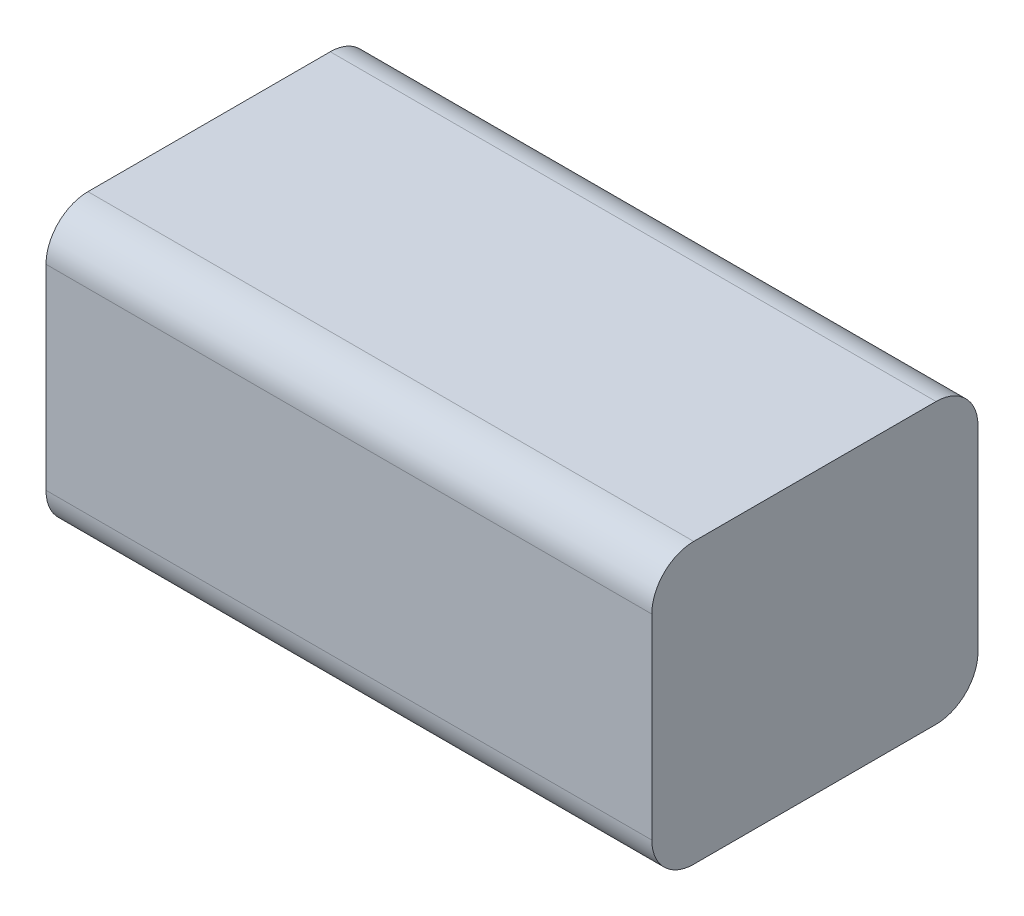
ISO-10303-21;
HEADER;
FILE_DESCRIPTION(('STEP AP214'),'2;1');
FILE_NAME('part.step','',(''),(''),'','','');
FILE_SCHEMA(('AUTOMOTIVE_DESIGN { 1 0 10303 214 1 1 1 1 }'));
ENDSEC;
DATA;
#1=APPLICATION_CONTEXT('core data for automotive mechanical design processes');
#2=APPLICATION_PROTOCOL_DEFINITION('international standard','automotive_design',2000,#1);
#3=PRODUCT_CONTEXT('',#1,'mechanical');
#4=PRODUCT('Part','Part','',(#3));
#5=PRODUCT_RELATED_PRODUCT_CATEGORY('part','',(#4));
#6=PRODUCT_DEFINITION_FORMATION('','',#4);
#7=PRODUCT_DEFINITION_CONTEXT('part definition',#1,'design');
#8=PRODUCT_DEFINITION('design','',#6,#7);
#9=PRODUCT_DEFINITION_SHAPE('','',#8);
#10=(LENGTH_UNIT() NAMED_UNIT(*) SI_UNIT(.MILLI.,.METRE.));
#11=(NAMED_UNIT(*) PLANE_ANGLE_UNIT() SI_UNIT($,.RADIAN.));
#12=(NAMED_UNIT(*) SI_UNIT($,.STERADIAN.) SOLID_ANGLE_UNIT());
#13=UNCERTAINTY_MEASURE_WITH_UNIT(LENGTH_MEASURE(1.E-05),#10,'distance_accuracy_value','');
#14=(GEOMETRIC_REPRESENTATION_CONTEXT(3) GLOBAL_UNCERTAINTY_ASSIGNED_CONTEXT((#13)) GLOBAL_UNIT_ASSIGNED_CONTEXT((#10,
#11,#12)) REPRESENTATION_CONTEXT('',''));
#15=CARTESIAN_POINT('',(0.,0.,0.));
#16=DIRECTION('',(0.,0.,1.));
#17=DIRECTION('',(1.,0.,0.));
#18=AXIS2_PLACEMENT_3D('',#15,#16,#17);
#19=CARTESIAN_POINT('',(65.,0.,35.));
#20=DIRECTION('',(0.,1.,0.));
#21=DIRECTION('',(-1.,0.,0.));
#22=AXIS2_PLACEMENT_3D('',#19,#20,#21);
#23=PLANE('',#22);
#24=DIRECTION('',(0.,0.,-1.));
#25=VECTOR('',#24,1.);
#26=CARTESIAN_POINT('',(65.,0.,35.));
#27=LINE('',#26,#25);
#28=CARTESIAN_POINT('',(65.,0.,30.5));
#29=VERTEX_POINT('',#28);
#30=CARTESIAN_POINT('',(65.,0.,4.5));
#31=VERTEX_POINT('',#30);
#32=EDGE_CURVE('E145',#29,#31,#27,.T.);
#33=ORIENTED_EDGE('',*,*,#32,.F.);
#34=DIRECTION('',(1.,0.,0.));
#35=VECTOR('',#34,1.);
#36=CARTESIAN_POINT('',(65.,0.,30.5));
#37=LINE('',#36,#35);
#38=CARTESIAN_POINT('',(0.,0.,30.5));
#39=VERTEX_POINT('',#38);
#40=EDGE_CURVE('E106',#29,#39,#37,.F.);
#41=ORIENTED_EDGE('',*,*,#40,.T.);
#42=DIRECTION('',(0.,0.,-1.));
#43=VECTOR('',#42,1.);
#44=CARTESIAN_POINT('',(0.,0.,35.));
#45=LINE('',#44,#43);
#46=CARTESIAN_POINT('',(0.,0.,4.5));
#47=VERTEX_POINT('',#46);
#48=EDGE_CURVE('E130',#39,#47,#45,.T.);
#49=ORIENTED_EDGE('',*,*,#48,.T.);
#50=DIRECTION('',(1.,0.,0.));
#51=VECTOR('',#50,1.);
#52=CARTESIAN_POINT('',(65.,0.,4.5));
#53=LINE('',#52,#51);
#54=EDGE_CURVE('E111',#47,#31,#53,.T.);
#55=ORIENTED_EDGE('',*,*,#54,.T.);
#56=EDGE_LOOP('',(#33,#41,#49,#55));
#57=FACE_BOUND('',#56,.T.);
#58=ADVANCED_FACE('F35',(#57),#23,.F.);
#59=CARTESIAN_POINT('',(65.,30.,35.));
#60=DIRECTION('',(-1.,0.,0.));
#61=DIRECTION('',(0.,0.,1.));
#62=AXIS2_PLACEMENT_3D('',#59,#60,#61);
#63=PLANE('',#62);
#64=DIRECTION('',(0.,1.,0.));
#65=VECTOR('',#64,1.);
#66=CARTESIAN_POINT('',(65.,30.,35.));
#67=LINE('',#66,#65);
#68=CARTESIAN_POINT('',(65.,4.50000000000001,35.));
#69=VERTEX_POINT('',#68);
#70=CARTESIAN_POINT('',(65.,25.5,35.));
#71=VERTEX_POINT('',#70);
#72=EDGE_CURVE('E119',#69,#71,#67,.T.);
#73=ORIENTED_EDGE('',*,*,#72,.F.);
#74=CARTESIAN_POINT('',(65.,4.50000000000002,30.5));
#75=DIRECTION('',(-1.,0.,0.));
#76=DIRECTION('',(0.,0.,1.));
#77=AXIS2_PLACEMENT_3D('',#74,#75,#76);
#78=CIRCLE('',#77,4.5);
#79=EDGE_CURVE('E101',#69,#29,#78,.F.);
#80=ORIENTED_EDGE('',*,*,#79,.T.);
#81=ORIENTED_EDGE('',*,*,#32,.T.);
#82=CARTESIAN_POINT('',(65.,4.50000000000002,4.5));
#83=DIRECTION('',(-1.,0.,0.));
#84=DIRECTION('',(0.,0.,1.));
#85=AXIS2_PLACEMENT_3D('',#82,#83,#84);
#86=CIRCLE('',#85,4.5);
#87=CARTESIAN_POINT('',(65.,4.50000000000001,0.));
#88=VERTEX_POINT('',#87);
#89=EDGE_CURVE('E112',#31,#88,#86,.F.);
#90=ORIENTED_EDGE('',*,*,#89,.T.);
#91=DIRECTION('',(0.,1.,0.));
#92=VECTOR('',#91,1.);
#93=CARTESIAN_POINT('',(65.,30.,0.));
#94=LINE('',#93,#92);
#95=CARTESIAN_POINT('',(65.,25.5,0.));
#96=VERTEX_POINT('',#95);
#97=EDGE_CURVE('E133',#88,#96,#94,.T.);
#98=ORIENTED_EDGE('',*,*,#97,.T.);
#99=CARTESIAN_POINT('',(65.,25.5,4.5));
#100=DIRECTION('',(-1.,0.,0.));
#101=DIRECTION('',(0.,0.,1.));
#102=AXIS2_PLACEMENT_3D('',#99,#100,#101);
#103=CIRCLE('',#102,4.5);
#104=CARTESIAN_POINT('',(65.,30.,4.5));
#105=VERTEX_POINT('',#104);
#106=EDGE_CURVE('E149',#96,#105,#103,.F.);
#107=ORIENTED_EDGE('',*,*,#106,.T.);
#108=DIRECTION('',(0.,0.,-1.));
#109=VECTOR('',#108,1.);
#110=CARTESIAN_POINT('',(65.,30.,35.));
#111=LINE('',#110,#109);
#112=CARTESIAN_POINT('',(65.,30.,30.5));
#113=VERTEX_POINT('',#112);
#114=EDGE_CURVE('E142',#113,#105,#111,.T.);
#115=ORIENTED_EDGE('',*,*,#114,.F.);
#116=CARTESIAN_POINT('',(65.,25.5,30.5));
#117=DIRECTION('',(-1.,0.,0.));
#118=DIRECTION('',(0.,0.,1.));
#119=AXIS2_PLACEMENT_3D('',#116,#117,#118);
#120=CIRCLE('',#119,4.5);
#121=EDGE_CURVE('E122',#113,#71,#120,.F.);
#122=ORIENTED_EDGE('',*,*,#121,.T.);
#123=EDGE_LOOP('',(#73,#80,#81,#90,#98,#107,#115,#122));
#124=FACE_BOUND('',#123,.T.);
#125=ADVANCED_FACE('F125',(#124),#63,.F.);
#126=CARTESIAN_POINT('',(0.,30.,35.));
#127=DIRECTION('',(0.,-1.,0.));
#128=DIRECTION('',(1.,0.,0.));
#129=AXIS2_PLACEMENT_3D('',#126,#127,#128);
#130=PLANE('',#129);
#131=ORIENTED_EDGE('',*,*,#114,.T.);
#132=DIRECTION('',(-1.,0.,0.));
#133=VECTOR('',#132,1.);
#134=CARTESIAN_POINT('',(0.,30.,4.5));
#135=LINE('',#134,#133);
#136=CARTESIAN_POINT('',(0.,30.,4.5));
#137=VERTEX_POINT('',#136);
#138=EDGE_CURVE('E11',#105,#137,#135,.T.);
#139=ORIENTED_EDGE('',*,*,#138,.T.);
#140=DIRECTION('',(0.,0.,-1.));
#141=VECTOR('',#140,1.);
#142=CARTESIAN_POINT('',(0.,30.,35.));
#143=LINE('',#142,#141);
#144=CARTESIAN_POINT('',(0.,30.,30.5));
#145=VERTEX_POINT('',#144);
#146=EDGE_CURVE('E140',#145,#137,#143,.T.);
#147=ORIENTED_EDGE('',*,*,#146,.F.);
#148=DIRECTION('',(-1.,0.,0.));
#149=VECTOR('',#148,1.);
#150=CARTESIAN_POINT('',(0.,30.,30.5));
#151=LINE('',#150,#149);
#152=EDGE_CURVE('E43',#145,#113,#151,.F.);
#153=ORIENTED_EDGE('',*,*,#152,.T.);
#154=EDGE_LOOP('',(#131,#139,#147,#153));
#155=FACE_BOUND('',#154,.T.);
#156=ADVANCED_FACE('F166',(#155),#130,.F.);
#157=CARTESIAN_POINT('',(0.,0.,35.));
#158=DIRECTION('',(1.,0.,0.));
#159=DIRECTION('',(0.,0.,-1.));
#160=AXIS2_PLACEMENT_3D('',#157,#158,#159);
#161=PLANE('',#160);
#162=ORIENTED_EDGE('',*,*,#48,.F.);
#163=CARTESIAN_POINT('',(0.,4.5,30.5));
#164=DIRECTION('',(1.,0.,0.));
#165=DIRECTION('',(0.,0.,-1.));
#166=AXIS2_PLACEMENT_3D('',#163,#164,#165);
#167=CIRCLE('',#166,4.5);
#168=CARTESIAN_POINT('',(0.,4.5,35.));
#169=VERTEX_POINT('',#168);
#170=EDGE_CURVE('E159',#39,#169,#167,.F.);
#171=ORIENTED_EDGE('',*,*,#170,.T.);
#172=DIRECTION('',(0.,-1.,0.));
#173=VECTOR('',#172,1.);
#174=CARTESIAN_POINT('',(0.,0.,35.));
#175=LINE('',#174,#173);
#176=CARTESIAN_POINT('',(0.,25.5,35.));
#177=VERTEX_POINT('',#176);
#178=EDGE_CURVE('E121',#177,#169,#175,.T.);
#179=ORIENTED_EDGE('',*,*,#178,.F.);
#180=CARTESIAN_POINT('',(0.,25.5,30.5));
#181=DIRECTION('',(1.,0.,0.));
#182=DIRECTION('',(0.,0.,-1.));
#183=AXIS2_PLACEMENT_3D('',#180,#181,#182);
#184=CIRCLE('',#183,4.5);
#185=EDGE_CURVE('E57',#177,#145,#184,.F.);
#186=ORIENTED_EDGE('',*,*,#185,.T.);
#187=ORIENTED_EDGE('',*,*,#146,.T.);
#188=CARTESIAN_POINT('',(0.,25.5,4.5));
#189=DIRECTION('',(1.,0.,0.));
#190=DIRECTION('',(0.,0.,-1.));
#191=AXIS2_PLACEMENT_3D('',#188,#189,#190);
#192=CIRCLE('',#191,4.5);
#193=CARTESIAN_POINT('',(0.,25.5,0.));
#194=VERTEX_POINT('',#193);
#195=EDGE_CURVE('E50',#137,#194,#192,.F.);
#196=ORIENTED_EDGE('',*,*,#195,.T.);
#197=DIRECTION('',(0.,-1.,0.));
#198=VECTOR('',#197,1.);
#199=CARTESIAN_POINT('',(0.,0.,0.));
#200=LINE('',#199,#198);
#201=CARTESIAN_POINT('',(0.,4.5,0.));
#202=VERTEX_POINT('',#201);
#203=EDGE_CURVE('E128',#194,#202,#200,.T.);
#204=ORIENTED_EDGE('',*,*,#203,.T.);
#205=CARTESIAN_POINT('',(0.,4.5,4.5));
#206=DIRECTION('',(1.,0.,0.));
#207=DIRECTION('',(0.,0.,-1.));
#208=AXIS2_PLACEMENT_3D('',#205,#206,#207);
#209=CIRCLE('',#208,4.5);
#210=EDGE_CURVE('E157',#202,#47,#209,.F.);
#211=ORIENTED_EDGE('',*,*,#210,.T.);
#212=EDGE_LOOP('',(#162,#171,#179,#186,#187,#196,#204,#211));
#213=FACE_BOUND('',#212,.T.);
#214=ADVANCED_FACE('F170',(#213),#161,.F.);
#215=CARTESIAN_POINT('',(0.,0.,35.));
#216=DIRECTION('',(0.,0.,-1.));
#217=DIRECTION('',(-1.,0.,0.));
#218=AXIS2_PLACEMENT_3D('',#215,#216,#217);
#219=PLANE('',#218);
#220=ORIENTED_EDGE('',*,*,#178,.T.);
#221=DIRECTION('',(1.,0.,0.));
#222=VECTOR('',#221,1.);
#223=CARTESIAN_POINT('',(0.,4.5,35.));
#224=LINE('',#223,#222);
#225=EDGE_CURVE('E105',#169,#69,#224,.T.);
#226=ORIENTED_EDGE('',*,*,#225,.T.);
#227=ORIENTED_EDGE('',*,*,#72,.T.);
#228=DIRECTION('',(-1.,0.,0.));
#229=VECTOR('',#228,1.);
#230=CARTESIAN_POINT('',(0.,25.5,35.));
#231=LINE('',#230,#229);
#232=EDGE_CURVE('E123',#71,#177,#231,.T.);
#233=ORIENTED_EDGE('',*,*,#232,.T.);
#234=EDGE_LOOP('',(#220,#226,#227,#233));
#235=FACE_BOUND('',#234,.T.);
#236=ADVANCED_FACE('F117',(#235),#219,.F.);
#237=CARTESIAN_POINT('',(0.,0.,0.));
#238=DIRECTION('',(0.,0.,-1.));
#239=DIRECTION('',(-1.,0.,0.));
#240=AXIS2_PLACEMENT_3D('',#237,#238,#239);
#241=PLANE('',#240);
#242=ORIENTED_EDGE('',*,*,#97,.F.);
#243=DIRECTION('',(1.,0.,0.));
#244=VECTOR('',#243,1.);
#245=CARTESIAN_POINT('',(0.,4.5,0.));
#246=LINE('',#245,#244);
#247=EDGE_CURVE('E163',#88,#202,#246,.F.);
#248=ORIENTED_EDGE('',*,*,#247,.T.);
#249=ORIENTED_EDGE('',*,*,#203,.F.);
#250=DIRECTION('',(-1.,0.,0.));
#251=VECTOR('',#250,1.);
#252=CARTESIAN_POINT('',(65.,25.5,0.));
#253=LINE('',#252,#251);
#254=EDGE_CURVE('E161',#194,#96,#253,.F.);
#255=ORIENTED_EDGE('',*,*,#254,.T.);
#256=EDGE_LOOP('',(#242,#248,#249,#255));
#257=FACE_BOUND('',#256,.T.);
#258=ADVANCED_FACE('F179',(#257),#241,.T.);
#259=CARTESIAN_POINT('',(0.,4.5,30.5));
#260=DIRECTION('',(1.,0.,0.));
#261=DIRECTION('',(0.,1.,0.));
#262=AXIS2_PLACEMENT_3D('',#259,#260,#261);
#263=CYLINDRICAL_SURFACE('',#262,4.5);
#264=ORIENTED_EDGE('',*,*,#170,.F.);
#265=ORIENTED_EDGE('',*,*,#40,.F.);
#266=ORIENTED_EDGE('',*,*,#79,.F.);
#267=ORIENTED_EDGE('',*,*,#225,.F.);
#268=EDGE_LOOP('',(#264,#265,#266,#267));
#269=FACE_BOUND('',#268,.T.);
#270=ADVANCED_FACE('F104',(#269),#263,.T.);
#271=CARTESIAN_POINT('',(65.,4.50000000000002,4.5));
#272=DIRECTION('',(-1.,0.,0.));
#273=DIRECTION('',(0.,-1.,0.));
#274=AXIS2_PLACEMENT_3D('',#271,#272,#273);
#275=CYLINDRICAL_SURFACE('',#274,4.5);
#276=ORIENTED_EDGE('',*,*,#210,.F.);
#277=ORIENTED_EDGE('',*,*,#247,.F.);
#278=ORIENTED_EDGE('',*,*,#89,.F.);
#279=ORIENTED_EDGE('',*,*,#54,.F.);
#280=EDGE_LOOP('',(#276,#277,#278,#279));
#281=FACE_BOUND('',#280,.T.);
#282=ADVANCED_FACE('F175',(#281),#275,.T.);
#283=CARTESIAN_POINT('',(0.,25.5,4.5));
#284=DIRECTION('',(1.,0.,0.));
#285=DIRECTION('',(0.,1.,0.));
#286=AXIS2_PLACEMENT_3D('',#283,#284,#285);
#287=CYLINDRICAL_SURFACE('',#286,4.5);
#288=ORIENTED_EDGE('',*,*,#106,.F.);
#289=ORIENTED_EDGE('',*,*,#254,.F.);
#290=ORIENTED_EDGE('',*,*,#195,.F.);
#291=ORIENTED_EDGE('',*,*,#138,.F.);
#292=EDGE_LOOP('',(#288,#289,#290,#291));
#293=FACE_BOUND('',#292,.T.);
#294=ADVANCED_FACE('F181',(#293),#287,.T.);
#295=CARTESIAN_POINT('',(0.,25.5,30.5));
#296=DIRECTION('',(-1.,0.,0.));
#297=DIRECTION('',(0.,-1.,0.));
#298=AXIS2_PLACEMENT_3D('',#295,#296,#297);
#299=CYLINDRICAL_SURFACE('',#298,4.5);
#300=ORIENTED_EDGE('',*,*,#121,.F.);
#301=ORIENTED_EDGE('',*,*,#152,.F.);
#302=ORIENTED_EDGE('',*,*,#185,.F.);
#303=ORIENTED_EDGE('',*,*,#232,.F.);
#304=EDGE_LOOP('',(#300,#301,#302,#303));
#305=FACE_BOUND('',#304,.T.);
#306=ADVANCED_FACE('F37',(#305),#299,.T.);
#307=CLOSED_SHELL('',(#58,#125,#156,#214,#236,#258,#270,#282,#294,#306));
#308=MANIFOLD_SOLID_BREP('B2',#307);
#309=ADVANCED_BREP_SHAPE_REPRESENTATION('',(#18,#308),#14);
#310=SHAPE_DEFINITION_REPRESENTATION(#9,#309);
ENDSEC;
END-ISO-10303-21;
